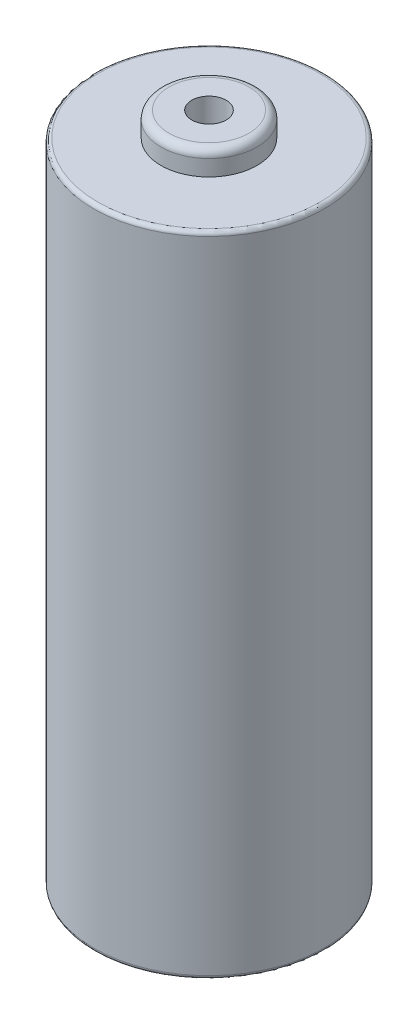
ISO-10303-21;
HEADER;
FILE_DESCRIPTION(('STEP AP214'),'2;1');
FILE_NAME('part.step','',(''),(''),'','','');
FILE_SCHEMA(('AUTOMOTIVE_DESIGN { 1 0 10303 214 1 1 1 1 }'));
ENDSEC;
DATA;
#1=APPLICATION_CONTEXT('core data for automotive mechanical design processes');
#2=APPLICATION_PROTOCOL_DEFINITION('international standard','automotive_design',2000,#1);
#3=PRODUCT_CONTEXT('',#1,'mechanical');
#4=PRODUCT('Part','Part','',(#3));
#5=PRODUCT_RELATED_PRODUCT_CATEGORY('part','',(#4));
#6=PRODUCT_DEFINITION_FORMATION('','',#4);
#7=PRODUCT_DEFINITION_CONTEXT('part definition',#1,'design');
#8=PRODUCT_DEFINITION('design','',#6,#7);
#9=PRODUCT_DEFINITION_SHAPE('','',#8);
#10=(LENGTH_UNIT() NAMED_UNIT(*) SI_UNIT(.MILLI.,.METRE.));
#11=(NAMED_UNIT(*) PLANE_ANGLE_UNIT() SI_UNIT($,.RADIAN.));
#12=(NAMED_UNIT(*) SI_UNIT($,.STERADIAN.) SOLID_ANGLE_UNIT());
#13=UNCERTAINTY_MEASURE_WITH_UNIT(LENGTH_MEASURE(1.E-05),#10,'distance_accuracy_value','');
#14=(GEOMETRIC_REPRESENTATION_CONTEXT(3) GLOBAL_UNCERTAINTY_ASSIGNED_CONTEXT((#13)) GLOBAL_UNIT_ASSIGNED_CONTEXT((#10,
#11,#12)) REPRESENTATION_CONTEXT('',''));
#15=CARTESIAN_POINT('',(0.,0.,0.));
#16=DIRECTION('',(0.,0.,1.));
#17=DIRECTION('',(1.,0.,0.));
#18=AXIS2_PLACEMENT_3D('',#15,#16,#17);
#19=CARTESIAN_POINT('',(0.,10.287,0.));
#20=DIRECTION('',(0.,1.,0.));
#21=DIRECTION('',(0.,0.,1.));
#22=AXIS2_PLACEMENT_3D('',#19,#20,#21);
#23=PLANE('',#22);
#24=CARTESIAN_POINT('',(0.,10.287,0.));
#25=DIRECTION('',(0.,1.,0.));
#26=DIRECTION('',(0.,0.,1.));
#27=AXIS2_PLACEMENT_3D('',#24,#25,#26);
#28=CIRCLE('',#27,3.5306);
#29=CARTESIAN_POINT('',(0.,10.287,3.5306));
#30=VERTEX_POINT('',#29);
#31=EDGE_CURVE('E42',#30,#30,#28,.T.);
#32=ORIENTED_EDGE('',*,*,#31,.T.);
#33=EDGE_LOOP('',(#32));
#34=FACE_BOUND('',#33,.T.);
#35=CARTESIAN_POINT('',(0.,10.287,0.));
#36=DIRECTION('',(0.,1.,0.));
#37=DIRECTION('',(0.,0.,1.));
#38=AXIS2_PLACEMENT_3D('',#35,#36,#37);
#39=CIRCLE('',#38,1.524);
#40=CARTESIAN_POINT('',(0.,10.287,-1.524));
#41=VERTEX_POINT('',#40);
#42=EDGE_CURVE('E57',#41,#41,#39,.T.);
#43=ORIENTED_EDGE('',*,*,#42,.F.);
#44=EDGE_LOOP('',(#43));
#45=FACE_BOUND('',#44,.T.);
#46=ADVANCED_FACE('F31',(#34,#45),#23,.T.);
#47=CARTESIAN_POINT('',(0.,10.287,0.));
#48=DIRECTION('',(0.,-1.,0.));
#49=DIRECTION('',(0.,0.,-1.));
#50=AXIS2_PLACEMENT_3D('',#47,#48,#49);
#51=CYLINDRICAL_SURFACE('',#50,3.6576);
#52=CARTESIAN_POINT('',(0.,-10.16,0.));
#53=DIRECTION('',(0.,1.,0.));
#54=DIRECTION('',(0.,0.,1.));
#55=AXIS2_PLACEMENT_3D('',#52,#53,#54);
#56=CIRCLE('',#55,3.6576);
#57=CARTESIAN_POINT('',(0.,-10.16,3.6576));
#58=VERTEX_POINT('',#57);
#59=EDGE_CURVE('E51',#58,#58,#56,.T.);
#60=ORIENTED_EDGE('',*,*,#59,.T.);
#61=EDGE_LOOP('',(#60));
#62=FACE_BOUND('',#61,.T.);
#63=CARTESIAN_POINT('',(0.,10.16,0.));
#64=DIRECTION('',(0.,1.,0.));
#65=DIRECTION('',(0.,0.,1.));
#66=AXIS2_PLACEMENT_3D('',#63,#64,#65);
#67=CIRCLE('',#66,3.6576);
#68=CARTESIAN_POINT('',(0.,10.16,3.6576));
#69=VERTEX_POINT('',#68);
#70=EDGE_CURVE('E54',#69,#69,#67,.F.);
#71=ORIENTED_EDGE('',*,*,#70,.T.);
#72=EDGE_LOOP('',(#71));
#73=FACE_BOUND('',#72,.T.);
#74=ADVANCED_FACE('F87',(#62,#73),#51,.T.);
#75=CARTESIAN_POINT('',(0.,-10.287,0.));
#76=DIRECTION('',(0.,1.,0.));
#77=DIRECTION('',(0.,0.,1.));
#78=AXIS2_PLACEMENT_3D('',#75,#76,#77);
#79=PLANE('',#78);
#80=CARTESIAN_POINT('',(0.,-10.287,0.));
#81=DIRECTION('',(0.,1.,0.));
#82=DIRECTION('',(0.,0.,1.));
#83=AXIS2_PLACEMENT_3D('',#80,#81,#82);
#84=CIRCLE('',#83,3.5306);
#85=CARTESIAN_POINT('',(0.,-10.287,3.5306));
#86=VERTEX_POINT('',#85);
#87=EDGE_CURVE('E46',#86,#86,#84,.F.);
#88=ORIENTED_EDGE('',*,*,#87,.T.);
#89=EDGE_LOOP('',(#88));
#90=FACE_BOUND('',#89,.T.);
#91=ADVANCED_FACE('F93',(#90),#79,.F.);
#92=CARTESIAN_POINT('',(0.,-10.16,0.));
#93=DIRECTION('',(0.,1.,0.));
#94=DIRECTION('',(0.,0.,1.));
#95=AXIS2_PLACEMENT_3D('',#92,#93,#94);
#96=TOROIDAL_SURFACE('',#95,3.5306,0.127);
#97=ORIENTED_EDGE('',*,*,#87,.F.);
#98=EDGE_LOOP('',(#97));
#99=FACE_BOUND('',#98,.T.);
#100=ORIENTED_EDGE('',*,*,#59,.F.);
#101=EDGE_LOOP('',(#100));
#102=FACE_BOUND('',#101,.T.);
#103=ADVANCED_FACE('F99',(#99,#102),#96,.T.);
#104=CARTESIAN_POINT('',(0.,10.16,0.));
#105=DIRECTION('',(0.,1.,0.));
#106=DIRECTION('',(0.,0.,1.));
#107=AXIS2_PLACEMENT_3D('',#104,#105,#106);
#108=TOROIDAL_SURFACE('',#107,3.5306,0.127);
#109=ORIENTED_EDGE('',*,*,#70,.F.);
#110=EDGE_LOOP('',(#109));
#111=FACE_BOUND('',#110,.T.);
#112=ORIENTED_EDGE('',*,*,#31,.F.);
#113=EDGE_LOOP('',(#112));
#114=FACE_BOUND('',#113,.T.);
#115=ADVANCED_FACE('F84',(#111,#114),#108,.T.);
#116=CARTESIAN_POINT('',(0.,11.049,0.));
#117=DIRECTION('',(0.,-1.,0.));
#118=DIRECTION('',(0.,0.,-1.));
#119=AXIS2_PLACEMENT_3D('',#116,#117,#118);
#120=CYLINDRICAL_SURFACE('',#119,1.524);
#121=CARTESIAN_POINT('',(0.,10.795,0.));
#122=DIRECTION('',(0.,1.,0.));
#123=DIRECTION('',(0.,0.,1.));
#124=AXIS2_PLACEMENT_3D('',#121,#122,#123);
#125=CIRCLE('',#124,1.524);
#126=CARTESIAN_POINT('',(0.,10.795,-1.524));
#127=VERTEX_POINT('',#126);
#128=EDGE_CURVE('E10',#127,#127,#125,.F.);
#129=CARTESIAN_POINT('',(0.,10.795,-1.524));
#130=CARTESIAN_POINT('',(0.,10.7897083333333,-1.524));
#131=CARTESIAN_POINT('',(0.,10.7844166666667,-1.524));
#132=CARTESIAN_POINT('',(0.,10.7738333333333,-1.524));
#133=CARTESIAN_POINT('',(0.,10.7685416666667,-1.524));
#134=CARTESIAN_POINT('',(0.,10.7579583333333,-1.524));
#135=CARTESIAN_POINT('',(0.,10.7526666666667,-1.524));
#136=CARTESIAN_POINT('',(0.,10.7420833333333,-1.524));
#137=CARTESIAN_POINT('',(0.,10.7367916666667,-1.524));
#138=CARTESIAN_POINT('',(0.,10.7262083333333,-1.524));
#139=CARTESIAN_POINT('',(0.,10.7209166666667,-1.524));
#140=CARTESIAN_POINT('',(0.,10.7103333333333,-1.524));
#141=CARTESIAN_POINT('',(0.,10.7050416666667,-1.524));
#142=CARTESIAN_POINT('',(0.,10.6944583333333,-1.524));
#143=CARTESIAN_POINT('',(0.,10.6891666666667,-1.524));
#144=CARTESIAN_POINT('',(0.,10.6785833333333,-1.524));
#145=CARTESIAN_POINT('',(0.,10.6732916666667,-1.524));
#146=CARTESIAN_POINT('',(0.,10.6627083333333,-1.524));
#147=CARTESIAN_POINT('',(0.,10.6574166666667,-1.524));
#148=CARTESIAN_POINT('',(0.,10.6468333333333,-1.524));
#149=CARTESIAN_POINT('',(0.,10.6415416666667,-1.524));
#150=CARTESIAN_POINT('',(0.,10.6309583333333,-1.524));
#151=CARTESIAN_POINT('',(0.,10.6256666666667,-1.524));
#152=CARTESIAN_POINT('',(0.,10.6150833333333,-1.524));
#153=CARTESIAN_POINT('',(0.,10.6097916666667,-1.524));
#154=CARTESIAN_POINT('',(0.,10.5992083333333,-1.524));
#155=CARTESIAN_POINT('',(0.,10.5939166666667,-1.524));
#156=CARTESIAN_POINT('',(0.,10.5833333333333,-1.524));
#157=CARTESIAN_POINT('',(0.,10.5780416666667,-1.524));
#158=CARTESIAN_POINT('',(0.,10.5674583333333,-1.524));
#159=CARTESIAN_POINT('',(0.,10.5621666666667,-1.524));
#160=CARTESIAN_POINT('',(0.,10.5515833333333,-1.524));
#161=CARTESIAN_POINT('',(0.,10.5462916666667,-1.524));
#162=CARTESIAN_POINT('',(0.,10.5357083333333,-1.524));
#163=CARTESIAN_POINT('',(0.,10.5304166666667,-1.524));
#164=CARTESIAN_POINT('',(0.,10.5198333333333,-1.524));
#165=CARTESIAN_POINT('',(0.,10.5145416666667,-1.524));
#166=CARTESIAN_POINT('',(0.,10.5039583333333,-1.524));
#167=CARTESIAN_POINT('',(0.,10.4986666666667,-1.524));
#168=CARTESIAN_POINT('',(0.,10.4880833333333,-1.524));
#169=CARTESIAN_POINT('',(0.,10.4827916666667,-1.524));
#170=CARTESIAN_POINT('',(0.,10.4722083333333,-1.524));
#171=CARTESIAN_POINT('',(0.,10.4669166666667,-1.524));
#172=CARTESIAN_POINT('',(0.,10.4563333333333,-1.524));
#173=CARTESIAN_POINT('',(0.,10.4510416666667,-1.524));
#174=CARTESIAN_POINT('',(0.,10.4404583333333,-1.524));
#175=CARTESIAN_POINT('',(0.,10.4351666666667,-1.524));
#176=CARTESIAN_POINT('',(0.,10.4245833333333,-1.524));
#177=CARTESIAN_POINT('',(0.,10.4192916666667,-1.524));
#178=CARTESIAN_POINT('',(0.,10.4087083333333,-1.524));
#179=CARTESIAN_POINT('',(0.,10.4034166666667,-1.524));
#180=CARTESIAN_POINT('',(0.,10.3928333333333,-1.524));
#181=CARTESIAN_POINT('',(0.,10.3875416666667,-1.524));
#182=CARTESIAN_POINT('',(0.,10.3769583333333,-1.524));
#183=CARTESIAN_POINT('',(0.,10.3716666666667,-1.524));
#184=CARTESIAN_POINT('',(0.,10.3610833333333,-1.524));
#185=CARTESIAN_POINT('',(0.,10.3557916666667,-1.524));
#186=CARTESIAN_POINT('',(0.,10.3452083333333,-1.524));
#187=CARTESIAN_POINT('',(0.,10.3399166666667,-1.524));
#188=CARTESIAN_POINT('',(0.,10.3293333333333,-1.524));
#189=CARTESIAN_POINT('',(0.,10.3240416666667,-1.524));
#190=CARTESIAN_POINT('',(0.,10.3134583333333,-1.524));
#191=CARTESIAN_POINT('',(0.,10.3081666666667,-1.524));
#192=CARTESIAN_POINT('',(0.,10.2975833333333,-1.524));
#193=CARTESIAN_POINT('',(0.,10.2922916666667,-1.524));
#194=CARTESIAN_POINT('',(0.,10.287,-1.524));
#195=B_SPLINE_CURVE_WITH_KNOTS('',3,(#129,#130,#131,#132,#133,#134,#135,#136,#137,#138,#139,
#140,#141,#142,#143,#144,#145,#146,#147,#148,#149,#150,#151,#152,#153,#154,#155,#156,#157,#158,
#159,#160,#161,#162,#163,#164,#165,#166,#167,#168,#169,#170,#171,#172,#173,#174,#175,#176,#177,
#178,#179,#180,#181,#182,#183,#184,#185,#186,#187,#188,#189,#190,#191,#192,#193,#194),
.UNSPECIFIED.,.F.,.F.,(4,2,2,2,2,2,2,2,2,2,2,2,2,2,2,2,2,2,2,2,2,2,2,2,2,2,2,2,2,2,2,2,4),(0.,
0.0158750000000003,0.0317500000000005,0.0476250000000008,0.0635000000000011,0.0793750000000013,
0.0952500000000016,0.111125,0.127,0.142875000000001,0.158750000000001,0.174625000000001,
0.190500000000001,0.206375,0.22225,0.238125,0.254000000000001,0.269875000000001,
0.285750000000001,0.301625000000002,0.3175,0.333375,0.349250000000001,0.365125000000001,
0.381000000000001,0.396875000000001,0.41275,0.428625,0.4445,0.460375000000001,0.476250000000001,
0.492125000000001,0.508000000000002),.UNSPECIFIED.);
#196=EDGE_CURVE('BSEAM77',#127,#41,#195,.T.);
#197=ORIENTED_EDGE('',*,*,#128,.T.);
#198=ORIENTED_EDGE('',*,*,#42,.T.);
#199=ORIENTED_EDGE('',*,*,#196,.T.);
#200=ORIENTED_EDGE('',*,*,#196,.F.);
#201=EDGE_LOOP('',(#197,#199,#198,#200));
#202=FACE_BOUND('',#201,.T.);
#203=ADVANCED_FACE('F77',(#202),#120,.T.);
#204=CARTESIAN_POINT('',(0.,11.049,0.));
#205=DIRECTION('',(0.,1.,0.));
#206=DIRECTION('',(0.,0.,1.));
#207=AXIS2_PLACEMENT_3D('',#204,#205,#206);
#208=PLANE('',#207);
#209=CARTESIAN_POINT('',(0.,11.049,0.));
#210=DIRECTION('',(0.,1.,0.));
#211=DIRECTION('',(0.,0.,1.));
#212=AXIS2_PLACEMENT_3D('',#209,#210,#211);
#213=CIRCLE('',#212,0.5461);
#214=CARTESIAN_POINT('',(0.,11.049,0.5461));
#215=VERTEX_POINT('',#214);
#216=EDGE_CURVE('E61',#215,#215,#213,.T.);
#217=ORIENTED_EDGE('',*,*,#216,.F.);
#218=EDGE_LOOP('',(#217));
#219=FACE_BOUND('',#218,.T.);
#220=CARTESIAN_POINT('',(0.,11.049,0.));
#221=DIRECTION('',(0.,1.,0.));
#222=DIRECTION('',(0.,0.,1.));
#223=AXIS2_PLACEMENT_3D('',#220,#221,#222);
#224=CIRCLE('',#223,1.27);
#225=CARTESIAN_POINT('',(0.,11.049,1.27));
#226=VERTEX_POINT('',#225);
#227=EDGE_CURVE('E38',#226,#226,#224,.T.);
#228=ORIENTED_EDGE('',*,*,#227,.T.);
#229=EDGE_LOOP('',(#228));
#230=FACE_BOUND('',#229,.T.);
#231=ADVANCED_FACE('F75',(#219,#230),#208,.T.);
#232=CARTESIAN_POINT('',(0.,10.795,0.));
#233=DIRECTION('',(0.,1.,0.));
#234=DIRECTION('',(0.,0.,1.));
#235=AXIS2_PLACEMENT_3D('',#232,#233,#234);
#236=TOROIDAL_SURFACE('',#235,1.27,0.254);
#237=ORIENTED_EDGE('',*,*,#128,.F.);
#238=EDGE_LOOP('',(#237));
#239=FACE_BOUND('',#238,.T.);
#240=ORIENTED_EDGE('',*,*,#227,.F.);
#241=EDGE_LOOP('',(#240));
#242=FACE_BOUND('',#241,.T.);
#243=ADVANCED_FACE('F33',(#239,#242),#236,.T.);
#244=CARTESIAN_POINT('',(0.,0.889000000000001,0.));
#245=DIRECTION('',(0.,1.,0.));
#246=DIRECTION('',(0.,0.,1.));
#247=AXIS2_PLACEMENT_3D('',#244,#245,#246);
#248=CYLINDRICAL_SURFACE('',#247,0.5461);
#249=CARTESIAN_POINT('',(0.,0.889000000000001,0.));
#250=DIRECTION('',(0.,1.,0.));
#251=DIRECTION('',(0.,0.,1.));
#252=AXIS2_PLACEMENT_3D('',#249,#250,#251);
#253=CIRCLE('',#252,0.5461);
#254=CARTESIAN_POINT('',(0.,0.889000000000001,0.5461));
#255=VERTEX_POINT('',#254);
#256=EDGE_CURVE('E60',#255,#255,#253,.T.);
#257=ORIENTED_EDGE('',*,*,#256,.F.);
#258=EDGE_LOOP('',(#257));
#259=FACE_BOUND('',#258,.T.);
#260=ORIENTED_EDGE('',*,*,#216,.T.);
#261=EDGE_LOOP('',(#260));
#262=FACE_BOUND('',#261,.T.);
#263=ADVANCED_FACE('F69',(#259,#262),#248,.F.);
#264=CARTESIAN_POINT('',(0.,0.889000000000001,0.));
#265=DIRECTION('',(0.,1.,0.));
#266=DIRECTION('',(0.,0.,1.));
#267=AXIS2_PLACEMENT_3D('',#264,#265,#266);
#268=PLANE('',#267);
#269=ORIENTED_EDGE('',*,*,#256,.T.);
#270=EDGE_LOOP('',(#269));
#271=FACE_BOUND('',#270,.T.);
#272=ADVANCED_FACE('F67',(#271),#268,.T.);
#273=CLOSED_SHELL('',(#46,#74,#91,#103,#115,#203,#231,#243,#263,#272));
#274=MANIFOLD_SOLID_BREP('B2',#273);
#275=ADVANCED_BREP_SHAPE_REPRESENTATION('',(#18,#274),#14);
#276=SHAPE_DEFINITION_REPRESENTATION(#9,#275);
ENDSEC;
END-ISO-10303-21;
